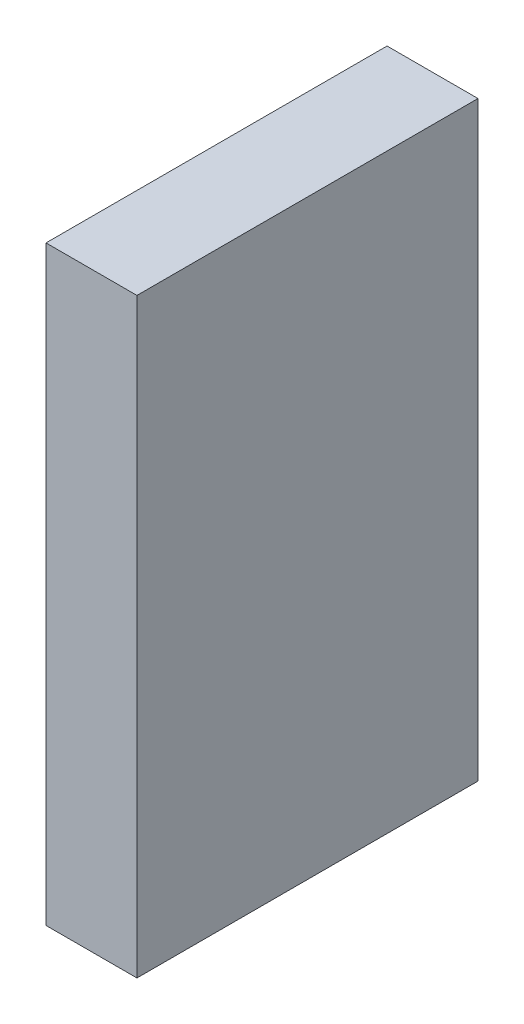
ISO-10303-21;
HEADER;
FILE_DESCRIPTION(('STEP AP214'),'2;1');
FILE_NAME('part.step','',(''),(''),'','','');
FILE_SCHEMA(('AUTOMOTIVE_DESIGN { 1 0 10303 214 1 1 1 1 }'));
ENDSEC;
DATA;
#1=APPLICATION_CONTEXT('core data for automotive mechanical design processes');
#2=APPLICATION_PROTOCOL_DEFINITION('international standard','automotive_design',2000,#1);
#3=PRODUCT_CONTEXT('',#1,'mechanical');
#4=PRODUCT('Part','Part','',(#3));
#5=PRODUCT_RELATED_PRODUCT_CATEGORY('part','',(#4));
#6=PRODUCT_DEFINITION_FORMATION('','',#4);
#7=PRODUCT_DEFINITION_CONTEXT('part definition',#1,'design');
#8=PRODUCT_DEFINITION('design','',#6,#7);
#9=PRODUCT_DEFINITION_SHAPE('','',#8);
#10=(LENGTH_UNIT() NAMED_UNIT(*) SI_UNIT(.MILLI.,.METRE.));
#11=(NAMED_UNIT(*) PLANE_ANGLE_UNIT() SI_UNIT($,.RADIAN.));
#12=(NAMED_UNIT(*) SI_UNIT($,.STERADIAN.) SOLID_ANGLE_UNIT());
#13=UNCERTAINTY_MEASURE_WITH_UNIT(LENGTH_MEASURE(1.E-05),#10,'distance_accuracy_value','');
#14=(GEOMETRIC_REPRESENTATION_CONTEXT(3) GLOBAL_UNCERTAINTY_ASSIGNED_CONTEXT((#13)) GLOBAL_UNIT_ASSIGNED_CONTEXT((#10,
#11,#12)) REPRESENTATION_CONTEXT('',''));
#15=CARTESIAN_POINT('',(0.,0.,0.));
#16=DIRECTION('',(0.,0.,1.));
#17=DIRECTION('',(1.,0.,0.));
#18=AXIS2_PLACEMENT_3D('',#15,#16,#17);
#19=CARTESIAN_POINT('',(4.,46.1800635620009,35.299281462461));
#20=DIRECTION('',(0.,0.,-1.));
#21=DIRECTION('',(0.,1.,0.));
#22=AXIS2_PLACEMENT_3D('',#19,#20,#21);
#23=PLANE('',#22);
#24=DIRECTION('',(0.,-1.,0.));
#25=VECTOR('',#24,1.);
#26=CARTESIAN_POINT('',(0.,46.1800635620009,35.299281462461));
#27=LINE('',#26,#25);
#28=CARTESIAN_POINT('',(0.,46.1800635620009,35.299281462461));
#29=VERTEX_POINT('',#28);
#30=CARTESIAN_POINT('',(0.,20.1800635620009,35.299281462461));
#31=VERTEX_POINT('',#30);
#32=EDGE_CURVE('E95',#29,#31,#27,.T.);
#33=ORIENTED_EDGE('',*,*,#32,.T.);
#34=DIRECTION('',(-1.,0.,0.));
#35=VECTOR('',#34,1.);
#36=CARTESIAN_POINT('',(4.,20.1800635620009,35.299281462461));
#37=LINE('',#36,#35);
#38=CARTESIAN_POINT('',(4.,20.1800635620009,35.299281462461));
#39=VERTEX_POINT('',#38);
#40=EDGE_CURVE('E11',#39,#31,#37,.T.);
#41=ORIENTED_EDGE('',*,*,#40,.F.);
#42=DIRECTION('',(0.,-1.,0.));
#43=VECTOR('',#42,1.);
#44=CARTESIAN_POINT('',(4.,46.1800635620009,35.299281462461));
#45=LINE('',#44,#43);
#46=CARTESIAN_POINT('',(4.,46.1800635620009,35.299281462461));
#47=VERTEX_POINT('',#46);
#48=EDGE_CURVE('E83',#47,#39,#45,.T.);
#49=ORIENTED_EDGE('',*,*,#48,.F.);
#50=DIRECTION('',(-1.,0.,0.));
#51=VECTOR('',#50,1.);
#52=CARTESIAN_POINT('',(4.,46.1800635620009,35.299281462461));
#53=LINE('',#52,#51);
#54=EDGE_CURVE('E91',#47,#29,#53,.T.);
#55=ORIENTED_EDGE('',*,*,#54,.T.);
#56=EDGE_LOOP('',(#33,#41,#49,#55));
#57=FACE_BOUND('',#56,.T.);
#58=ADVANCED_FACE('F32',(#57),#23,.F.);
#59=CARTESIAN_POINT('',(4.,20.1800635620009,35.299281462461));
#60=DIRECTION('',(0.,1.,0.));
#61=DIRECTION('',(0.,0.,1.));
#62=AXIS2_PLACEMENT_3D('',#59,#60,#61);
#63=PLANE('',#62);
#64=DIRECTION('',(0.,0.,-1.));
#65=VECTOR('',#64,1.);
#66=CARTESIAN_POINT('',(0.,20.1800635620009,35.299281462461));
#67=LINE('',#66,#65);
#68=CARTESIAN_POINT('',(0.,20.1800635620009,20.299281462461));
#69=VERTEX_POINT('',#68);
#70=EDGE_CURVE('E87',#31,#69,#67,.T.);
#71=ORIENTED_EDGE('',*,*,#70,.T.);
#72=DIRECTION('',(-1.,0.,0.));
#73=VECTOR('',#72,1.);
#74=CARTESIAN_POINT('',(4.,20.1800635620009,20.299281462461));
#75=LINE('',#74,#73);
#76=CARTESIAN_POINT('',(4.,20.1800635620009,20.299281462461));
#77=VERTEX_POINT('',#76);
#78=EDGE_CURVE('E40',#77,#69,#75,.T.);
#79=ORIENTED_EDGE('',*,*,#78,.F.);
#80=DIRECTION('',(0.,0.,-1.));
#81=VECTOR('',#80,1.);
#82=CARTESIAN_POINT('',(4.,20.1800635620009,35.299281462461));
#83=LINE('',#82,#81);
#84=EDGE_CURVE('E78',#39,#77,#83,.T.);
#85=ORIENTED_EDGE('',*,*,#84,.F.);
#86=ORIENTED_EDGE('',*,*,#40,.T.);
#87=EDGE_LOOP('',(#71,#79,#85,#86));
#88=FACE_BOUND('',#87,.T.);
#89=ADVANCED_FACE('F86',(#88),#63,.F.);
#90=CARTESIAN_POINT('',(4.,46.1800635620009,20.299281462461));
#91=DIRECTION('',(0.,0.,1.));
#92=DIRECTION('',(0.,-1.,0.));
#93=AXIS2_PLACEMENT_3D('',#90,#91,#92);
#94=PLANE('',#93);
#95=DIRECTION('',(0.,1.,0.));
#96=VECTOR('',#95,1.);
#97=CARTESIAN_POINT('',(0.,46.1800635620009,20.299281462461));
#98=LINE('',#97,#96);
#99=CARTESIAN_POINT('',(0.,46.1800635620009,20.299281462461));
#100=VERTEX_POINT('',#99);
#101=EDGE_CURVE('E65',#69,#100,#98,.T.);
#102=ORIENTED_EDGE('',*,*,#101,.T.);
#103=DIRECTION('',(-1.,0.,0.));
#104=VECTOR('',#103,1.);
#105=CARTESIAN_POINT('',(4.,46.1800635620009,20.299281462461));
#106=LINE('',#105,#104);
#107=CARTESIAN_POINT('',(4.,46.1800635620009,20.299281462461));
#108=VERTEX_POINT('',#107);
#109=EDGE_CURVE('E88',#108,#100,#106,.T.);
#110=ORIENTED_EDGE('',*,*,#109,.F.);
#111=DIRECTION('',(0.,1.,0.));
#112=VECTOR('',#111,1.);
#113=CARTESIAN_POINT('',(4.,46.1800635620009,20.299281462461));
#114=LINE('',#113,#112);
#115=EDGE_CURVE('E81',#77,#108,#114,.T.);
#116=ORIENTED_EDGE('',*,*,#115,.F.);
#117=ORIENTED_EDGE('',*,*,#78,.T.);
#118=EDGE_LOOP('',(#102,#110,#116,#117));
#119=FACE_BOUND('',#118,.T.);
#120=ADVANCED_FACE('F89',(#119),#94,.F.);
#121=CARTESIAN_POINT('',(4.,46.1800635620009,35.299281462461));
#122=DIRECTION('',(0.,-1.,0.));
#123=DIRECTION('',(0.,0.,-1.));
#124=AXIS2_PLACEMENT_3D('',#121,#122,#123);
#125=PLANE('',#124);
#126=DIRECTION('',(0.,0.,1.));
#127=VECTOR('',#126,1.);
#128=CARTESIAN_POINT('',(0.,46.1800635620009,35.299281462461));
#129=LINE('',#128,#127);
#130=EDGE_CURVE('E71',#100,#29,#129,.T.);
#131=ORIENTED_EDGE('',*,*,#130,.T.);
#132=ORIENTED_EDGE('',*,*,#54,.F.);
#133=DIRECTION('',(0.,0.,1.));
#134=VECTOR('',#133,1.);
#135=CARTESIAN_POINT('',(4.,46.1800635620009,35.299281462461));
#136=LINE('',#135,#134);
#137=EDGE_CURVE('E48',#108,#47,#136,.T.);
#138=ORIENTED_EDGE('',*,*,#137,.F.);
#139=ORIENTED_EDGE('',*,*,#109,.T.);
#140=EDGE_LOOP('',(#131,#132,#138,#139));
#141=FACE_BOUND('',#140,.T.);
#142=ADVANCED_FACE('F102',(#141),#125,.F.);
#143=CARTESIAN_POINT('',(4.,20.1800635620009,35.299281462461));
#144=DIRECTION('',(1.,0.,0.));
#145=DIRECTION('',(0.,0.,-1.));
#146=AXIS2_PLACEMENT_3D('',#143,#144,#145);
#147=PLANE('',#146);
#148=ORIENTED_EDGE('',*,*,#48,.T.);
#149=ORIENTED_EDGE('',*,*,#84,.T.);
#150=ORIENTED_EDGE('',*,*,#115,.T.);
#151=ORIENTED_EDGE('',*,*,#137,.T.);
#152=EDGE_LOOP('',(#148,#149,#150,#151));
#153=FACE_BOUND('',#152,.T.);
#154=ADVANCED_FACE('F79',(#153),#147,.T.);
#155=CARTESIAN_POINT('',(0.,20.1800635620009,35.299281462461));
#156=DIRECTION('',(1.,0.,0.));
#157=DIRECTION('',(0.,0.,-1.));
#158=AXIS2_PLACEMENT_3D('',#155,#156,#157);
#159=PLANE('',#158);
#160=ORIENTED_EDGE('',*,*,#32,.F.);
#161=ORIENTED_EDGE('',*,*,#130,.F.);
#162=ORIENTED_EDGE('',*,*,#101,.F.);
#163=ORIENTED_EDGE('',*,*,#70,.F.);
#164=EDGE_LOOP('',(#160,#161,#162,#163));
#165=FACE_BOUND('',#164,.T.);
#166=ADVANCED_FACE('F105',(#165),#159,.F.);
#167=CLOSED_SHELL('',(#58,#89,#120,#142,#154,#166));
#168=MANIFOLD_SOLID_BREP('B2',#167);
#169=ADVANCED_BREP_SHAPE_REPRESENTATION('',(#18,#168),#14);
#170=SHAPE_DEFINITION_REPRESENTATION(#9,#169);
ENDSEC;
END-ISO-10303-21;
